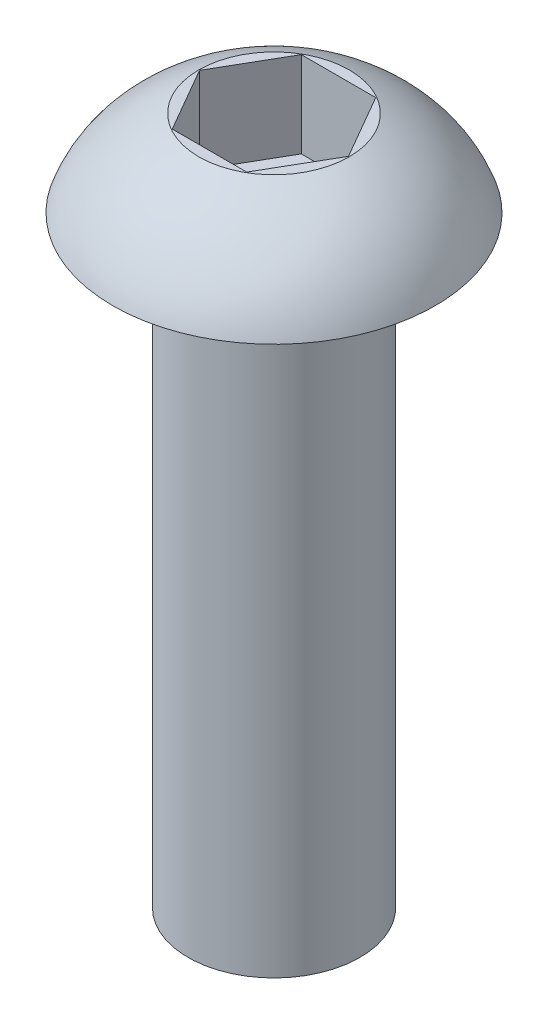
ISO-10303-21;
HEADER;
FILE_DESCRIPTION(('STEP AP214'),'2;1');
FILE_NAME('part.step','',(''),(''),'','','');
FILE_SCHEMA(('AUTOMOTIVE_DESIGN { 1 0 10303 214 1 1 1 1 }'));
ENDSEC;
DATA;
#1=APPLICATION_CONTEXT('core data for automotive mechanical design processes');
#2=APPLICATION_PROTOCOL_DEFINITION('international standard','automotive_design',2000,#1);
#3=PRODUCT_CONTEXT('',#1,'mechanical');
#4=PRODUCT('Part','Part','',(#3));
#5=PRODUCT_RELATED_PRODUCT_CATEGORY('part','',(#4));
#6=PRODUCT_DEFINITION_FORMATION('','',#4);
#7=PRODUCT_DEFINITION_CONTEXT('part definition',#1,'design');
#8=PRODUCT_DEFINITION('design','',#6,#7);
#9=PRODUCT_DEFINITION_SHAPE('','',#8);
#10=(LENGTH_UNIT() NAMED_UNIT(*) SI_UNIT(.MILLI.,.METRE.));
#11=(NAMED_UNIT(*) PLANE_ANGLE_UNIT() SI_UNIT($,.RADIAN.));
#12=(NAMED_UNIT(*) SI_UNIT($,.STERADIAN.) SOLID_ANGLE_UNIT());
#13=UNCERTAINTY_MEASURE_WITH_UNIT(LENGTH_MEASURE(1.E-05),#10,'distance_accuracy_value','');
#14=(GEOMETRIC_REPRESENTATION_CONTEXT(3) GLOBAL_UNCERTAINTY_ASSIGNED_CONTEXT((#13)) GLOBAL_UNIT_ASSIGNED_CONTEXT((#10,
#11,#12)) REPRESENTATION_CONTEXT('',''));
#15=CARTESIAN_POINT('',(0.,0.,0.));
#16=DIRECTION('',(0.,0.,1.));
#17=DIRECTION('',(1.,0.,0.));
#18=AXIS2_PLACEMENT_3D('',#15,#16,#17);
#19=CARTESIAN_POINT('',(0.,-7.,0.999999999999999));
#20=DIRECTION('',(0.,-1.,0.));
#21=DIRECTION('',(0.,0.,-1.));
#22=AXIS2_PLACEMENT_3D('',#19,#20,#21);
#23=CYLINDRICAL_SURFACE('',#22,2.);
#24=CARTESIAN_POINT('',(0.,-7.,0.999999999999999));
#25=DIRECTION('',(0.,-1.,0.));
#26=DIRECTION('',(0.,0.,-1.));
#27=AXIS2_PLACEMENT_3D('',#24,#25,#26);
#28=CIRCLE('',#27,2.);
#29=CARTESIAN_POINT('',(0.,-7.,-1.));
#30=VERTEX_POINT('',#29);
#31=EDGE_CURVE('E167',#30,#30,#28,.T.);
#32=ORIENTED_EDGE('',*,*,#31,.F.);
#33=EDGE_LOOP('',(#32));
#34=FACE_BOUND('',#33,.T.);
#35=CARTESIAN_POINT('',(0.,7.,1.));
#36=DIRECTION('',(0.,-1.,0.));
#37=DIRECTION('',(0.,0.,-1.));
#38=AXIS2_PLACEMENT_3D('',#35,#36,#37);
#39=CIRCLE('',#38,2.);
#40=CARTESIAN_POINT('',(0.,7.,-0.999999999999999));
#41=VERTEX_POINT('',#40);
#42=EDGE_CURVE('E11',#41,#41,#39,.T.);
#43=ORIENTED_EDGE('',*,*,#42,.T.);
#44=EDGE_LOOP('',(#43));
#45=FACE_BOUND('',#44,.T.);
#46=ADVANCED_FACE('F41',(#34,#45),#23,.T.);
#47=CARTESIAN_POINT('',(0.,7.,0.));
#48=DIRECTION('',(0.,-1.,0.));
#49=DIRECTION('',(0.,0.,-1.));
#50=AXIS2_PLACEMENT_3D('',#47,#48,#49);
#51=PLANE('',#50);
#52=CARTESIAN_POINT('',(0.,7.,1.));
#53=DIRECTION('',(0.,-1.,0.));
#54=DIRECTION('',(0.,0.,-1.));
#55=AXIS2_PLACEMENT_3D('',#52,#53,#54);
#56=CIRCLE('',#55,3.75);
#57=CARTESIAN_POINT('',(0.,7.,-2.75));
#58=VERTEX_POINT('',#57);
#59=EDGE_CURVE('E49',#58,#58,#56,.T.);
#60=ORIENTED_EDGE('',*,*,#59,.T.);
#61=EDGE_LOOP('',(#60));
#62=FACE_BOUND('',#61,.T.);
#63=ORIENTED_EDGE('',*,*,#42,.F.);
#64=EDGE_LOOP('',(#63));
#65=FACE_BOUND('',#64,.T.);
#66=ADVANCED_FACE('F180',(#62,#65),#51,.T.);
#67=CARTESIAN_POINT('',(0.,9.,-0.750000000000001));
#68=CARTESIAN_POINT('',(0.,8.31957253408555,-2.29097588116488));
#69=CARTESIAN_POINT('',(0.,7.,-2.75));
#70=B_SPLINE_CURVE_WITH_KNOTS('',2,(#67,#68,#69),.UNSPECIFIED.,.F.,.F.,(3,3),(0.,
0.856055688663619),.UNSPECIFIED.);
#71=CARTESIAN_POINT('',(0.,-7.,0.999999999999999));
#72=DIRECTION('',(0.,-1.,0.));
#73=AXIS1_PLACEMENT('',#71,#72);
#74=SURFACE_OF_REVOLUTION('',#70,#73);
#75=ORIENTED_EDGE('',*,*,#59,.F.);
#76=EDGE_LOOP('',(#75));
#77=FACE_BOUND('',#76,.T.);
#78=CARTESIAN_POINT('',(0.,9.,1.));
#79=DIRECTION('',(0.,1.,0.));
#80=DIRECTION('',(0.,0.,1.));
#81=AXIS2_PLACEMENT_3D('',#78,#79,#80);
#82=CIRCLE('',#81,1.75);
#83=CARTESIAN_POINT('',(0.,9.,2.75));
#84=VERTEX_POINT('',#83);
#85=EDGE_CURVE('E111',#84,#84,#82,.T.);
#86=ORIENTED_EDGE('',*,*,#85,.F.);
#87=EDGE_LOOP('',(#86));
#88=FACE_BOUND('',#87,.T.);
#89=ADVANCED_FACE('F176',(#77,#88),#74,.T.);
#90=CARTESIAN_POINT('',(0.,-7.,0.));
#91=DIRECTION('',(0.,-1.,0.));
#92=DIRECTION('',(0.,0.,-1.));
#93=AXIS2_PLACEMENT_3D('',#90,#91,#92);
#94=PLANE('',#93);
#95=ORIENTED_EDGE('',*,*,#31,.T.);
#96=EDGE_LOOP('',(#95));
#97=FACE_BOUND('',#96,.T.);
#98=ADVANCED_FACE('F179',(#97),#94,.T.);
#99=CARTESIAN_POINT('',(0.,9.,1.));
#100=DIRECTION('',(0.,1.,0.));
#101=DIRECTION('',(0.,0.,1.));
#102=AXIS2_PLACEMENT_3D('',#99,#100,#101);
#103=PLANE('',#102);
#104=ORIENTED_EDGE('',*,*,#85,.T.);
#105=EDGE_LOOP('',(#104));
#106=FACE_BOUND('',#105,.T.);
#107=DIRECTION('',(-0.5,0.,-0.866025403784438));
#108=VECTOR('',#107,1.);
#109=CARTESIAN_POINT('',(1.73205080756888,9.,1.));
#110=LINE('',#109,#108);
#111=CARTESIAN_POINT('',(1.73205080756888,9.,1.));
#112=VERTEX_POINT('',#111);
#113=CARTESIAN_POINT('',(0.866025403784438,9.,-0.5));
#114=VERTEX_POINT('',#113);
#115=EDGE_CURVE('E102',#112,#114,#110,.T.);
#116=ORIENTED_EDGE('',*,*,#115,.F.);
#117=DIRECTION('',(0.5,0.,-0.866025403784439));
#118=VECTOR('',#117,1.);
#119=CARTESIAN_POINT('',(0.866025403784438,9.,2.5));
#120=LINE('',#119,#118);
#121=CARTESIAN_POINT('',(0.866025403784438,9.,2.5));
#122=VERTEX_POINT('',#121);
#123=EDGE_CURVE('E93',#122,#112,#120,.T.);
#124=ORIENTED_EDGE('',*,*,#123,.F.);
#125=DIRECTION('',(1.,0.,0.));
#126=VECTOR('',#125,1.);
#127=CARTESIAN_POINT('',(-0.866025403784439,9.,2.5));
#128=LINE('',#127,#126);
#129=CARTESIAN_POINT('',(-0.866025403784439,9.,2.5));
#130=VERTEX_POINT('',#129);
#131=EDGE_CURVE('E129',#130,#122,#128,.T.);
#132=ORIENTED_EDGE('',*,*,#131,.F.);
#133=DIRECTION('',(0.5,0.,0.866025403784439));
#134=VECTOR('',#133,1.);
#135=CARTESIAN_POINT('',(-1.73205080756888,9.,1.));
#136=LINE('',#135,#134);
#137=CARTESIAN_POINT('',(-1.73205080756888,9.,1.));
#138=VERTEX_POINT('',#137);
#139=EDGE_CURVE('E126',#138,#130,#136,.T.);
#140=ORIENTED_EDGE('',*,*,#139,.F.);
#141=DIRECTION('',(-0.5,0.,0.866025403784439));
#142=VECTOR('',#141,1.);
#143=CARTESIAN_POINT('',(-0.866025403784439,9.,-0.5));
#144=LINE('',#143,#142);
#145=CARTESIAN_POINT('',(-0.866025403784439,9.,-0.5));
#146=VERTEX_POINT('',#145);
#147=EDGE_CURVE('E121',#146,#138,#144,.T.);
#148=ORIENTED_EDGE('',*,*,#147,.F.);
#149=DIRECTION('',(-1.,0.,0.));
#150=VECTOR('',#149,1.);
#151=CARTESIAN_POINT('',(0.866025403784438,9.,-0.5));
#152=LINE('',#151,#150);
#153=EDGE_CURVE('E117',#114,#146,#152,.T.);
#154=ORIENTED_EDGE('',*,*,#153,.F.);
#155=EDGE_LOOP('',(#116,#124,#132,#140,#148,#154));
#156=FACE_BOUND('',#155,.T.);
#157=ADVANCED_FACE('F115',(#106,#156),#103,.T.);
#158=CARTESIAN_POINT('',(0.866025403784438,9.,2.5));
#159=DIRECTION('',(-0.866025403784439,0.,-0.5));
#160=DIRECTION('',(-0.5,0.,0.866025403784439));
#161=AXIS2_PLACEMENT_3D('',#158,#159,#160);
#162=PLANE('',#161);
#163=DIRECTION('',(0.5,0.,-0.866025403784439));
#164=VECTOR('',#163,1.);
#165=CARTESIAN_POINT('',(0.866025403784438,7.,2.5));
#166=LINE('',#165,#164);
#167=CARTESIAN_POINT('',(0.866025403784438,7.,2.5));
#168=VERTEX_POINT('',#167);
#169=CARTESIAN_POINT('',(1.73205080756888,7.,1.));
#170=VERTEX_POINT('',#169);
#171=EDGE_CURVE('E132',#168,#170,#166,.T.);
#172=ORIENTED_EDGE('',*,*,#171,.F.);
#173=DIRECTION('',(0.,-1.,0.));
#174=VECTOR('',#173,1.);
#175=CARTESIAN_POINT('',(0.866025403784438,9.,2.5));
#176=LINE('',#175,#174);
#177=EDGE_CURVE('E56',#122,#168,#176,.T.);
#178=ORIENTED_EDGE('',*,*,#177,.F.);
#179=ORIENTED_EDGE('',*,*,#123,.T.);
#180=DIRECTION('',(0.,-1.,0.));
#181=VECTOR('',#180,1.);
#182=CARTESIAN_POINT('',(1.73205080756888,9.,1.));
#183=LINE('',#182,#181);
#184=EDGE_CURVE('E96',#112,#170,#183,.T.);
#185=ORIENTED_EDGE('',*,*,#184,.T.);
#186=EDGE_LOOP('',(#172,#178,#179,#185));
#187=FACE_BOUND('',#186,.T.);
#188=ADVANCED_FACE('F95',(#187),#162,.T.);
#189=CARTESIAN_POINT('',(1.73205080756888,9.,1.));
#190=DIRECTION('',(-0.866025403784439,0.,0.5));
#191=DIRECTION('',(0.5,0.,0.866025403784438));
#192=AXIS2_PLACEMENT_3D('',#189,#190,#191);
#193=PLANE('',#192);
#194=DIRECTION('',(-0.5,0.,-0.866025403784438));
#195=VECTOR('',#194,1.);
#196=CARTESIAN_POINT('',(1.73205080756888,7.,1.));
#197=LINE('',#196,#195);
#198=CARTESIAN_POINT('',(0.866025403784438,7.,-0.5));
#199=VERTEX_POINT('',#198);
#200=EDGE_CURVE('E109',#170,#199,#197,.T.);
#201=ORIENTED_EDGE('',*,*,#200,.F.);
#202=ORIENTED_EDGE('',*,*,#184,.F.);
#203=ORIENTED_EDGE('',*,*,#115,.T.);
#204=DIRECTION('',(0.,-1.,0.));
#205=VECTOR('',#204,1.);
#206=CARTESIAN_POINT('',(0.866025403784438,9.,-0.5));
#207=LINE('',#206,#205);
#208=EDGE_CURVE('E112',#114,#199,#207,.T.);
#209=ORIENTED_EDGE('',*,*,#208,.T.);
#210=EDGE_LOOP('',(#201,#202,#203,#209));
#211=FACE_BOUND('',#210,.T.);
#212=ADVANCED_FACE('F106',(#211),#193,.T.);
#213=CARTESIAN_POINT('',(0.866025403784438,9.,-0.5));
#214=DIRECTION('',(0.,0.,1.));
#215=DIRECTION('',(1.,0.,0.));
#216=AXIS2_PLACEMENT_3D('',#213,#214,#215);
#217=PLANE('',#216);
#218=DIRECTION('',(-1.,0.,0.));
#219=VECTOR('',#218,1.);
#220=CARTESIAN_POINT('',(0.866025403784438,7.,-0.5));
#221=LINE('',#220,#219);
#222=CARTESIAN_POINT('',(-0.866025403784439,7.,-0.5));
#223=VERTEX_POINT('',#222);
#224=EDGE_CURVE('E137',#199,#223,#221,.T.);
#225=ORIENTED_EDGE('',*,*,#224,.F.);
#226=ORIENTED_EDGE('',*,*,#208,.F.);
#227=ORIENTED_EDGE('',*,*,#153,.T.);
#228=DIRECTION('',(0.,-1.,0.));
#229=VECTOR('',#228,1.);
#230=CARTESIAN_POINT('',(-0.866025403784439,9.,-0.5));
#231=LINE('',#230,#229);
#232=EDGE_CURVE('E159',#146,#223,#231,.T.);
#233=ORIENTED_EDGE('',*,*,#232,.T.);
#234=EDGE_LOOP('',(#225,#226,#227,#233));
#235=FACE_BOUND('',#234,.T.);
#236=ADVANCED_FACE('F211',(#235),#217,.T.);
#237=CARTESIAN_POINT('',(-0.866025403784439,9.,-0.5));
#238=DIRECTION('',(0.866025403784439,0.,0.5));
#239=DIRECTION('',(0.5,0.,-0.866025403784439));
#240=AXIS2_PLACEMENT_3D('',#237,#238,#239);
#241=PLANE('',#240);
#242=DIRECTION('',(-0.5,0.,0.866025403784439));
#243=VECTOR('',#242,1.);
#244=CARTESIAN_POINT('',(-0.866025403784439,7.,-0.5));
#245=LINE('',#244,#243);
#246=CARTESIAN_POINT('',(-1.73205080756888,7.,1.));
#247=VERTEX_POINT('',#246);
#248=EDGE_CURVE('E141',#223,#247,#245,.T.);
#249=ORIENTED_EDGE('',*,*,#248,.F.);
#250=ORIENTED_EDGE('',*,*,#232,.F.);
#251=ORIENTED_EDGE('',*,*,#147,.T.);
#252=DIRECTION('',(0.,-1.,0.));
#253=VECTOR('',#252,1.);
#254=CARTESIAN_POINT('',(-1.73205080756888,9.,1.));
#255=LINE('',#254,#253);
#256=EDGE_CURVE('E156',#138,#247,#255,.T.);
#257=ORIENTED_EDGE('',*,*,#256,.T.);
#258=EDGE_LOOP('',(#249,#250,#251,#257));
#259=FACE_BOUND('',#258,.T.);
#260=ADVANCED_FACE('F214',(#259),#241,.T.);
#261=CARTESIAN_POINT('',(-1.73205080756888,9.,1.));
#262=DIRECTION('',(0.866025403784439,0.,-0.5));
#263=DIRECTION('',(-0.5,0.,-0.866025403784439));
#264=AXIS2_PLACEMENT_3D('',#261,#262,#263);
#265=PLANE('',#264);
#266=DIRECTION('',(0.5,0.,0.866025403784439));
#267=VECTOR('',#266,1.);
#268=CARTESIAN_POINT('',(-1.73205080756888,7.,1.));
#269=LINE('',#268,#267);
#270=CARTESIAN_POINT('',(-0.866025403784439,7.,2.5));
#271=VERTEX_POINT('',#270);
#272=EDGE_CURVE('E145',#247,#271,#269,.T.);
#273=ORIENTED_EDGE('',*,*,#272,.F.);
#274=ORIENTED_EDGE('',*,*,#256,.F.);
#275=ORIENTED_EDGE('',*,*,#139,.T.);
#276=DIRECTION('',(0.,-1.,0.));
#277=VECTOR('',#276,1.);
#278=CARTESIAN_POINT('',(-0.866025403784439,9.,2.5));
#279=LINE('',#278,#277);
#280=EDGE_CURVE('E61',#130,#271,#279,.T.);
#281=ORIENTED_EDGE('',*,*,#280,.T.);
#282=EDGE_LOOP('',(#273,#274,#275,#281));
#283=FACE_BOUND('',#282,.T.);
#284=ADVANCED_FACE('F218',(#283),#265,.T.);
#285=CARTESIAN_POINT('',(-0.866025403784439,9.,2.5));
#286=DIRECTION('',(0.,0.,-1.));
#287=DIRECTION('',(-1.,0.,0.));
#288=AXIS2_PLACEMENT_3D('',#285,#286,#287);
#289=PLANE('',#288);
#290=DIRECTION('',(1.,0.,0.));
#291=VECTOR('',#290,1.);
#292=CARTESIAN_POINT('',(-0.866025403784439,7.,2.5));
#293=LINE('',#292,#291);
#294=EDGE_CURVE('E103',#271,#168,#293,.T.);
#295=ORIENTED_EDGE('',*,*,#294,.F.);
#296=ORIENTED_EDGE('',*,*,#280,.F.);
#297=ORIENTED_EDGE('',*,*,#131,.T.);
#298=ORIENTED_EDGE('',*,*,#177,.T.);
#299=EDGE_LOOP('',(#295,#296,#297,#298));
#300=FACE_BOUND('',#299,.T.);
#301=ADVANCED_FACE('F222',(#300),#289,.T.);
#302=CARTESIAN_POINT('',(0.,7.,0.));
#303=DIRECTION('',(0.,-1.,0.));
#304=DIRECTION('',(0.,0.,-1.));
#305=AXIS2_PLACEMENT_3D('',#302,#303,#304);
#306=PLANE('',#305);
#307=ORIENTED_EDGE('',*,*,#294,.T.);
#308=ORIENTED_EDGE('',*,*,#171,.T.);
#309=ORIENTED_EDGE('',*,*,#200,.T.);
#310=ORIENTED_EDGE('',*,*,#224,.T.);
#311=ORIENTED_EDGE('',*,*,#248,.T.);
#312=ORIENTED_EDGE('',*,*,#272,.T.);
#313=EDGE_LOOP('',(#307,#308,#309,#310,#311,#312));
#314=FACE_BOUND('',#313,.T.);
#315=ADVANCED_FACE('F182',(#314),#306,.F.);
#316=CLOSED_SHELL('',(#46,#66,#89,#98,#157,#188,#212,#236,#260,#284,#301,#315));
#317=MANIFOLD_SOLID_BREP('B2',#316);
#318=ADVANCED_BREP_SHAPE_REPRESENTATION('',(#18,#317),#14);
#319=SHAPE_DEFINITION_REPRESENTATION(#9,#318);
ENDSEC;
END-ISO-10303-21;
